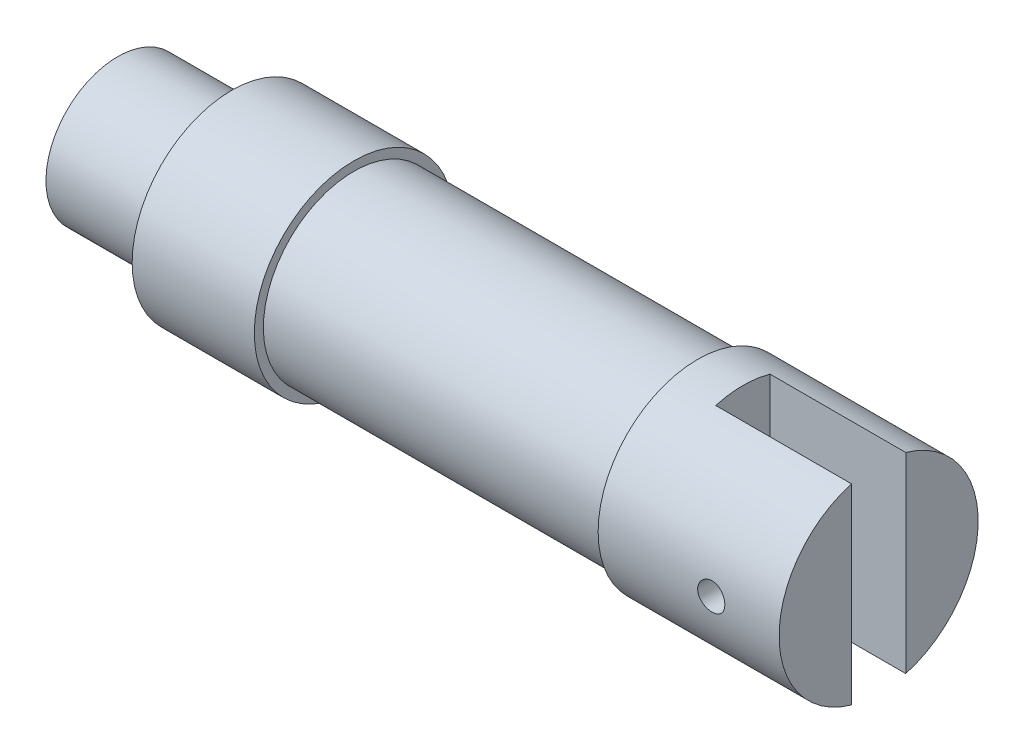
ISO-10303-21;
HEADER;
FILE_DESCRIPTION(('STEP AP214'),'2;1');
FILE_NAME('part.step','',(''),(''),'','','');
FILE_SCHEMA(('AUTOMOTIVE_DESIGN { 1 0 10303 214 1 1 1 1 }'));
ENDSEC;
DATA;
#1=APPLICATION_CONTEXT('core data for automotive mechanical design processes');
#2=APPLICATION_PROTOCOL_DEFINITION('international standard','automotive_design',2000,#1);
#3=PRODUCT_CONTEXT('',#1,'mechanical');
#4=PRODUCT('Part','Part','',(#3));
#5=PRODUCT_RELATED_PRODUCT_CATEGORY('part','',(#4));
#6=PRODUCT_DEFINITION_FORMATION('','',#4);
#7=PRODUCT_DEFINITION_CONTEXT('part definition',#1,'design');
#8=PRODUCT_DEFINITION('design','',#6,#7);
#9=PRODUCT_DEFINITION_SHAPE('','',#8);
#10=(LENGTH_UNIT() NAMED_UNIT(*) SI_UNIT(.MILLI.,.METRE.));
#11=(NAMED_UNIT(*) PLANE_ANGLE_UNIT() SI_UNIT($,.RADIAN.));
#12=(NAMED_UNIT(*) SI_UNIT($,.STERADIAN.) SOLID_ANGLE_UNIT());
#13=UNCERTAINTY_MEASURE_WITH_UNIT(LENGTH_MEASURE(1.E-05),#10,'distance_accuracy_value','');
#14=(GEOMETRIC_REPRESENTATION_CONTEXT(3) GLOBAL_UNCERTAINTY_ASSIGNED_CONTEXT((#13)) GLOBAL_UNIT_ASSIGNED_CONTEXT((#10,
#11,#12)) REPRESENTATION_CONTEXT('',''));
#15=CARTESIAN_POINT('',(0.,0.,0.));
#16=DIRECTION('',(0.,0.,1.));
#17=DIRECTION('',(1.,0.,0.));
#18=AXIS2_PLACEMENT_3D('',#15,#16,#17);
#19=CARTESIAN_POINT('',(168.2,22.,0.));
#20=DIRECTION('',(-1.,0.,0.));
#21=DIRECTION('',(0.,-1.,0.));
#22=AXIS2_PLACEMENT_3D('',#19,#20,#21);
#23=PLANE('',#22);
#24=CARTESIAN_POINT('',(168.2,0.,0.));
#25=DIRECTION('',(-1.,0.,0.));
#26=DIRECTION('',(0.,-1.,0.));
#27=AXIS2_PLACEMENT_3D('',#24,#25,#26);
#28=CIRCLE('',#27,22.);
#29=CARTESIAN_POINT('',(168.2,-21.1660104885167,6.));
#30=VERTEX_POINT('',#29);
#31=CARTESIAN_POINT('',(168.2,21.1660104885167,6.));
#32=VERTEX_POINT('',#31);
#33=EDGE_CURVE('E106',#30,#32,#28,.T.);
#34=ORIENTED_EDGE('',*,*,#33,.F.);
#35=DIRECTION('',(0.,1.,0.));
#36=VECTOR('',#35,1.);
#37=CARTESIAN_POINT('',(168.2,22.,6.));
#38=LINE('',#37,#36);
#39=EDGE_CURVE('E136',#30,#32,#38,.T.);
#40=ORIENTED_EDGE('',*,*,#39,.T.);
#41=EDGE_LOOP('',(#34,#40));
#42=FACE_BOUND('',#41,.T.);
#43=ADVANCED_FACE('F41',(#42),#23,.F.);
#44=CARTESIAN_POINT('',(40.,3.,0.));
#45=DIRECTION('',(1.,0.,0.));
#46=DIRECTION('',(0.,1.,0.));
#47=AXIS2_PLACEMENT_3D('',#44,#45,#46);
#48=PLANE('',#47);
#49=CARTESIAN_POINT('',(40.,0.,0.));
#50=DIRECTION('',(-1.,0.,0.));
#51=DIRECTION('',(0.,-1.,0.));
#52=AXIS2_PLACEMENT_3D('',#49,#50,#51);
#53=CIRCLE('',#52,3.);
#54=CARTESIAN_POINT('',(40.,-3.,0.));
#55=VERTEX_POINT('',#54);
#56=EDGE_CURVE('E131',#55,#55,#53,.T.);
#57=ORIENTED_EDGE('',*,*,#56,.T.);
#58=EDGE_LOOP('',(#57));
#59=FACE_BOUND('',#58,.T.);
#60=ADVANCED_FACE('F43',(#59),#48,.F.);
#61=CARTESIAN_POINT('',(40.,0.,0.));
#62=DIRECTION('',(-1.,0.,0.));
#63=DIRECTION('',(0.,-1.,0.));
#64=AXIS2_PLACEMENT_3D('',#61,#62,#63);
#65=CYLINDRICAL_SURFACE('',#64,3.);
#66=ORIENTED_EDGE('',*,*,#56,.F.);
#67=EDGE_LOOP('',(#66));
#68=FACE_BOUND('',#67,.T.);
#69=CARTESIAN_POINT('',(0.,0.,0.));
#70=DIRECTION('',(-1.,0.,0.));
#71=DIRECTION('',(0.,-1.,0.));
#72=AXIS2_PLACEMENT_3D('',#69,#70,#71);
#73=CIRCLE('',#72,3.);
#74=CARTESIAN_POINT('',(0.,-3.,0.));
#75=VERTEX_POINT('',#74);
#76=EDGE_CURVE('E128',#75,#75,#73,.T.);
#77=ORIENTED_EDGE('',*,*,#76,.T.);
#78=EDGE_LOOP('',(#77));
#79=FACE_BOUND('',#78,.T.);
#80=ADVANCED_FACE('F148',(#68,#79),#65,.F.);
#81=CARTESIAN_POINT('',(0.,3.,0.));
#82=DIRECTION('',(1.,0.,0.));
#83=DIRECTION('',(0.,1.,0.));
#84=AXIS2_PLACEMENT_3D('',#81,#82,#83);
#85=PLANE('',#84);
#86=ORIENTED_EDGE('',*,*,#76,.F.);
#87=EDGE_LOOP('',(#86));
#88=FACE_BOUND('',#87,.T.);
#89=CARTESIAN_POINT('',(0.,0.,0.));
#90=DIRECTION('',(-1.,0.,0.));
#91=DIRECTION('',(0.,-1.,0.));
#92=AXIS2_PLACEMENT_3D('',#89,#90,#91);
#93=CIRCLE('',#92,15.85);
#94=CARTESIAN_POINT('',(0.,-15.85,0.));
#95=VERTEX_POINT('',#94);
#96=EDGE_CURVE('E125',#95,#95,#93,.T.);
#97=ORIENTED_EDGE('',*,*,#96,.T.);
#98=EDGE_LOOP('',(#97));
#99=FACE_BOUND('',#98,.T.);
#100=ADVANCED_FACE('F309',(#88,#99),#85,.F.);
#101=CARTESIAN_POINT('',(40.,0.,0.));
#102=DIRECTION('',(-1.,0.,0.));
#103=DIRECTION('',(0.,-1.,0.));
#104=AXIS2_PLACEMENT_3D('',#101,#102,#103);
#105=CYLINDRICAL_SURFACE('',#104,15.85);
#106=ORIENTED_EDGE('',*,*,#96,.F.);
#107=EDGE_LOOP('',(#106));
#108=FACE_BOUND('',#107,.T.);
#109=CARTESIAN_POINT('',(25.2,0.,0.));
#110=DIRECTION('',(-1.,0.,0.));
#111=DIRECTION('',(0.,-1.,0.));
#112=AXIS2_PLACEMENT_3D('',#109,#110,#111);
#113=CIRCLE('',#112,15.85);
#114=CARTESIAN_POINT('',(25.2,-15.85,0.));
#115=VERTEX_POINT('',#114);
#116=EDGE_CURVE('E122',#115,#115,#113,.T.);
#117=ORIENTED_EDGE('',*,*,#116,.T.);
#118=EDGE_LOOP('',(#117));
#119=FACE_BOUND('',#118,.T.);
#120=ADVANCED_FACE('F298',(#108,#119),#105,.T.);
#121=CARTESIAN_POINT('',(25.2,15.85,0.));
#122=DIRECTION('',(1.,0.,0.));
#123=DIRECTION('',(0.,1.,0.));
#124=AXIS2_PLACEMENT_3D('',#121,#122,#123);
#125=PLANE('',#124);
#126=ORIENTED_EDGE('',*,*,#116,.F.);
#127=EDGE_LOOP('',(#126));
#128=FACE_BOUND('',#127,.T.);
#129=CARTESIAN_POINT('',(25.2,0.,0.));
#130=DIRECTION('',(-1.,0.,0.));
#131=DIRECTION('',(0.,-1.,0.));
#132=AXIS2_PLACEMENT_3D('',#129,#130,#131);
#133=CIRCLE('',#132,22.);
#134=CARTESIAN_POINT('',(25.2,-22.,0.));
#135=VERTEX_POINT('',#134);
#136=EDGE_CURVE('E119',#135,#135,#133,.T.);
#137=ORIENTED_EDGE('',*,*,#136,.T.);
#138=EDGE_LOOP('',(#137));
#139=FACE_BOUND('',#138,.T.);
#140=ADVANCED_FACE('F287',(#128,#139),#125,.F.);
#141=CARTESIAN_POINT('',(40.,0.,0.));
#142=DIRECTION('',(-1.,0.,0.));
#143=DIRECTION('',(0.,-1.,0.));
#144=AXIS2_PLACEMENT_3D('',#141,#142,#143);
#145=CYLINDRICAL_SURFACE('',#144,22.);
#146=ORIENTED_EDGE('',*,*,#136,.F.);
#147=EDGE_LOOP('',(#146));
#148=FACE_BOUND('',#147,.T.);
#149=CARTESIAN_POINT('',(52.2,0.,0.));
#150=DIRECTION('',(-1.,0.,0.));
#151=DIRECTION('',(0.,-1.,0.));
#152=AXIS2_PLACEMENT_3D('',#149,#150,#151);
#153=CIRCLE('',#152,22.);
#154=CARTESIAN_POINT('',(52.2,-22.,0.));
#155=VERTEX_POINT('',#154);
#156=EDGE_CURVE('E116',#155,#155,#153,.T.);
#157=ORIENTED_EDGE('',*,*,#156,.T.);
#158=EDGE_LOOP('',(#157));
#159=FACE_BOUND('',#158,.T.);
#160=ADVANCED_FACE('F276',(#148,#159),#145,.T.);
#161=CARTESIAN_POINT('',(52.2,22.,0.));
#162=DIRECTION('',(-1.,0.,0.));
#163=DIRECTION('',(0.,-1.,0.));
#164=AXIS2_PLACEMENT_3D('',#161,#162,#163);
#165=PLANE('',#164);
#166=ORIENTED_EDGE('',*,*,#156,.F.);
#167=EDGE_LOOP('',(#166));
#168=FACE_BOUND('',#167,.T.);
#169=CARTESIAN_POINT('',(52.2,0.,0.));
#170=DIRECTION('',(-1.,0.,0.));
#171=DIRECTION('',(0.,-1.,0.));
#172=AXIS2_PLACEMENT_3D('',#169,#170,#171);
#173=CIRCLE('',#172,20.);
#174=CARTESIAN_POINT('',(52.2,-20.,0.));
#175=VERTEX_POINT('',#174);
#176=EDGE_CURVE('E113',#175,#175,#173,.T.);
#177=ORIENTED_EDGE('',*,*,#176,.T.);
#178=EDGE_LOOP('',(#177));
#179=FACE_BOUND('',#178,.T.);
#180=ADVANCED_FACE('F265',(#168,#179),#165,.F.);
#181=CARTESIAN_POINT('',(40.,0.,0.));
#182=DIRECTION('',(-1.,0.,0.));
#183=DIRECTION('',(0.,-1.,0.));
#184=AXIS2_PLACEMENT_3D('',#181,#182,#183);
#185=CYLINDRICAL_SURFACE('',#184,20.);
#186=ORIENTED_EDGE('',*,*,#176,.F.);
#187=EDGE_LOOP('',(#186));
#188=FACE_BOUND('',#187,.T.);
#189=CARTESIAN_POINT('',(128.2,0.,0.));
#190=DIRECTION('',(-1.,0.,0.));
#191=DIRECTION('',(0.,-1.,0.));
#192=AXIS2_PLACEMENT_3D('',#189,#190,#191);
#193=CIRCLE('',#192,20.);
#194=CARTESIAN_POINT('',(128.2,-20.,0.));
#195=VERTEX_POINT('',#194);
#196=EDGE_CURVE('E110',#195,#195,#193,.T.);
#197=ORIENTED_EDGE('',*,*,#196,.T.);
#198=EDGE_LOOP('',(#197));
#199=FACE_BOUND('',#198,.T.);
#200=ADVANCED_FACE('F164',(#188,#199),#185,.T.);
#201=CARTESIAN_POINT('',(128.2,20.,0.));
#202=DIRECTION('',(1.,0.,0.));
#203=DIRECTION('',(0.,1.,0.));
#204=AXIS2_PLACEMENT_3D('',#201,#202,#203);
#205=PLANE('',#204);
#206=ORIENTED_EDGE('',*,*,#196,.F.);
#207=EDGE_LOOP('',(#206));
#208=FACE_BOUND('',#207,.T.);
#209=CARTESIAN_POINT('',(128.2,0.,0.));
#210=DIRECTION('',(-1.,0.,0.));
#211=DIRECTION('',(0.,-1.,0.));
#212=AXIS2_PLACEMENT_3D('',#209,#210,#211);
#213=CIRCLE('',#212,22.);
#214=CARTESIAN_POINT('',(128.2,-22.,0.));
#215=VERTEX_POINT('',#214);
#216=EDGE_CURVE('E107',#215,#215,#213,.T.);
#217=ORIENTED_EDGE('',*,*,#216,.T.);
#218=EDGE_LOOP('',(#217));
#219=FACE_BOUND('',#218,.T.);
#220=ADVANCED_FACE('F159',(#208,#219),#205,.F.);
#221=CARTESIAN_POINT('',(40.,0.,0.));
#222=DIRECTION('',(-1.,0.,0.));
#223=DIRECTION('',(0.,-1.,0.));
#224=AXIS2_PLACEMENT_3D('',#221,#222,#223);
#225=CYLINDRICAL_SURFACE('',#224,22.);
#226=CARTESIAN_POINT('',(156.2,0.,-22.));
#227=CARTESIAN_POINT('',(156.199992961085,0.167676826859713,-21.9999974934523));
#228=CARTESIAN_POINT('',(156.185894814655,0.335455204579483,-21.9980628542975));
#229=CARTESIAN_POINT('',(156.129882233551,0.666334195282816,-21.990531328169));
#230=CARTESIAN_POINT('',(156.0879396011,0.829429891319706,-21.984930728802));
#231=CARTESIAN_POINT('',(155.977504532319,1.14610618738718,-21.9706975479658));
#232=CARTESIAN_POINT('',(155.909030921596,1.29969344490645,-21.9620671167838));
#233=CARTESIAN_POINT('',(155.74752095088,1.59317060489946,-21.9427314544459));
#234=CARTESIAN_POINT('',(155.654488455491,1.73306265771743,-21.9320265498011));
#235=CARTESIAN_POINT('',(155.445855571415,1.99611512762448,-21.9096571993851));
#236=CARTESIAN_POINT('',(155.330127153993,2.11917356924752,-21.8979875381044));
#237=CARTESIAN_POINT('',(155.079662778415,2.34418667816086,-21.8750454311864));
#238=CARTESIAN_POINT('',(154.944925800277,2.44614021225597,-21.863773006905));
#239=CARTESIAN_POINT('',(154.659596123552,2.62643701049845,-21.8428507554376));
#240=CARTESIAN_POINT('',(154.50894162999,2.70468332936807,-21.833207660216));
#241=CARTESIAN_POINT('',(154.196476369253,2.83472528970555,-21.8167058813552));
#242=CARTESIAN_POINT('',(154.03466610478,2.88652212215969,-21.8098470723459));
#243=CARTESIAN_POINT('',(153.705547512853,2.96188181110179,-21.7997409938434));
#244=CARTESIAN_POINT('',(153.538279561418,2.98561797729097,-21.7964715644898));
#245=CARTESIAN_POINT('',(153.202105053952,3.00471910119332,-21.7938468760964));
#246=CARTESIAN_POINT('',(153.033198576334,3.00008540995951,-21.7944914306616));
#247=CARTESIAN_POINT('',(152.699756548798,2.96272034038478,-21.7996016067311));
#248=CARTESIAN_POINT('',(152.535199047266,2.93018077835179,-21.8040411420393));
#249=CARTESIAN_POINT('',(152.213901918935,2.83822735390598,-21.8162003481636));
#250=CARTESIAN_POINT('',(152.057162477974,2.77881285300505,-21.8239200969101));
#251=CARTESIAN_POINT('',(151.755360147925,2.63459283520414,-21.841799165874));
#252=CARTESIAN_POINT('',(151.610337141464,2.54970487715522,-21.851966385515));
#253=CARTESIAN_POINT('',(151.336521702228,2.35700646089641,-21.8735888866938));
#254=CARTESIAN_POINT('',(151.207730152467,2.24919475646083,-21.8850442382436));
#255=CARTESIAN_POINT('',(150.968920891011,2.01265055567599,-21.908067947796));
#256=CARTESIAN_POINT('',(150.859066719375,1.88375290146846,-21.9196364588217));
#257=CARTESIAN_POINT('',(150.662527016803,1.60926188881081,-21.9414949411558));
#258=CARTESIAN_POINT('',(150.575841558074,1.46366847832926,-21.9517849084796));
#259=CARTESIAN_POINT('',(150.42809627364,1.15978593896088,-21.9699350817542));
#260=CARTESIAN_POINT('',(150.367047715215,1.00149126426257,-21.9777942189694));
#261=CARTESIAN_POINT('',(150.272444324109,0.676766175879787,-21.9901879040614));
#262=CARTESIAN_POINT('',(150.238887957813,0.510336216560255,-21.994722637384));
#263=CARTESIAN_POINT('',(150.200435830869,0.175477814735334,-21.9999322760751));
#264=CARTESIAN_POINT('',(150.195314982823,0.00707567277567577,-22.0006374938028));
#265=CARTESIAN_POINT('',(150.213283756661,-0.328184588178519,-21.9981907754197));
#266=CARTESIAN_POINT('',(150.236372660566,-0.495042746360847,-21.9950389374767));
#267=CARTESIAN_POINT('',(150.309918446419,-0.821806756729903,-21.9852510531583));
#268=CARTESIAN_POINT('',(150.360266991143,-0.981737441241129,-21.9786288024664));
#269=CARTESIAN_POINT('',(150.486789518066,-1.29088628219118,-21.9626408812727));
#270=CARTESIAN_POINT('',(150.562964526034,-1.44010401285044,-21.9532751018062));
#271=CARTESIAN_POINT('',(150.739515077448,-1.72458978596493,-21.9327672607206));
#272=CARTESIAN_POINT('',(150.840035005601,-1.8597674567065,-21.921614741142));
#273=CARTESIAN_POINT('',(151.062219155915,-2.11141402650923,-21.8988110628535));
#274=CARTESIAN_POINT('',(151.183884384113,-2.22788203490665,-21.8871598804385));
#275=CARTESIAN_POINT('',(151.445901666017,-2.43961065908227,-21.8645773754606));
#276=CARTESIAN_POINT('',(151.586375426962,-2.53472132761286,-21.8536515002427));
#277=CARTESIAN_POINT('',(151.8814366154,-2.69999679098532,-21.8338493008832));
#278=CARTESIAN_POINT('',(152.036023715717,-2.77016216392284,-21.8249729292469));
#279=CARTESIAN_POINT('',(152.354455513346,-2.88331699010305,-21.8103129452134));
#280=CARTESIAN_POINT('',(152.518270588872,-2.92638854100027,-21.8045199979441));
#281=CARTESIAN_POINT('',(152.850893043656,-2.98439621095037,-21.7966568632046));
#282=CARTESIAN_POINT('',(153.019700142029,-2.99933390995801,-21.7945864666819));
#283=CARTESIAN_POINT('',(153.356021950782,-3.00061713169436,-21.7944097083055));
#284=CARTESIAN_POINT('',(153.523535793217,-2.98719829381275,-21.796270677241));
#285=CARTESIAN_POINT('',(153.853902277397,-2.93265092877067,-21.8036764010729));
#286=CARTESIAN_POINT('',(154.016754921802,-2.89152241742378,-21.809221153867));
#287=CARTESIAN_POINT('',(154.33313027877,-2.7828011290096,-21.8233590163958));
#288=CARTESIAN_POINT('',(154.486657734965,-2.71522193961382,-21.8319505607859));
#289=CARTESIAN_POINT('',(154.780232597213,-2.5555407967824,-21.85121622249));
#290=CARTESIAN_POINT('',(154.920279708521,-2.46343830731649,-21.8618903853246));
#291=CARTESIAN_POINT('',(155.1841200732,-2.25645830446167,-21.884224598437));
#292=CARTESIAN_POINT('',(155.307775272445,-2.14140556846806,-21.8958918112072));
#293=CARTESIAN_POINT('',(155.534110693422,-1.89215973610724,-21.9188357460712));
#294=CARTESIAN_POINT('',(155.636785996623,-1.7579621639157,-21.9301123760831));
#295=CARTESIAN_POINT('',(155.818651934767,-1.47353098640399,-21.9510618593984));
#296=CARTESIAN_POINT('',(155.897734316553,-1.32322763703471,-21.9607272329125));
#297=CARTESIAN_POINT('',(156.029418962106,-1.01141938786062,-21.9772907411432));
#298=CARTESIAN_POINT('',(156.082049419387,-0.849926624043754,-21.9841918205545));
#299=CARTESIAN_POINT('',(156.147020874128,-0.573037194174386,-21.9928235213462));
#300=CARTESIAN_POINT('',(156.166858721595,-0.459371577392151,-21.9955012855773));
#301=CARTESIAN_POINT('',(156.193350641962,-0.230486627293779,-21.9990903781477));
#302=CARTESIAN_POINT('',(156.200004838813,-0.115267308595407,-22.0000017230944));
#303=CARTESIAN_POINT('',(156.2,0.,-22.));
#304=B_SPLINE_CURVE_WITH_KNOTS('',3,(#226,#227,#228,#229,#230,#231,#232,#233,#234,#235,#236,
#237,#238,#239,#240,#241,#242,#243,#244,#245,#246,#247,#248,#249,#250,#251,#252,#253,#254,#255,
#256,#257,#258,#259,#260,#261,#262,#263,#264,#265,#266,#267,#268,#269,#270,#271,#272,#273,#274,
#275,#276,#277,#278,#279,#280,#281,#282,#283,#284,#285,#286,#287,#288,#289,#290,#291,#292,#293,
#294,#295,#296,#297,#298,#299,#300,#301,#302,#303),.UNSPECIFIED.,.T.,.F.,(4,2,2,2,2,2,2,2,2,2,2,
2,2,2,2,2,2,2,2,2,2,2,2,2,2,2,2,2,2,2,2,2,2,2,2,2,2,2,4),(0.,0.502609376172297,1.00572851685899,
1.50849131075064,2.0111750366105,2.51678051739006,3.02241313883224,3.53008635854346,
4.03773671636778,4.54223504001233,5.04670933820383,5.54774357745447,6.04878972077748,
6.55147524370065,7.05418810159104,7.56104569493678,8.06790486792018,8.57498657022921,
9.0820399837334,9.58507392409647,10.0880950617602,10.5891315761908,11.0901879929896,
11.5942921539578,12.0984203054351,12.6059843025882,13.1135365364146,13.619543320099,
14.1255216863572,14.6273119749012,15.1291019770798,15.6306345481248,16.1321780825684,
16.6377084708873,17.1433572401882,17.6512916404935,18.1586835098852,18.5041992012524,
18.8497116441534),.UNSPECIFIED.);
#305=CARTESIAN_POINT('',(156.2,0.,-22.));
#306=VERTEX_POINT('',#305);
#307=EDGE_CURVE('E90',#306,#306,#304,.T.);
#308=ORIENTED_EDGE('',*,*,#307,.T.);
#309=EDGE_LOOP('',(#308));
#310=FACE_BOUND('',#309,.T.);
#311=CARTESIAN_POINT('',(156.2,0.,22.));
#312=CARTESIAN_POINT('',(156.199992961085,-0.16767682685972,21.9999974934523));
#313=CARTESIAN_POINT('',(156.185894814655,-0.33545520457949,21.9980628542975));
#314=CARTESIAN_POINT('',(156.129882233551,-0.666334195282822,21.990531328169));
#315=CARTESIAN_POINT('',(156.0879396011,-0.829429891319712,21.984930728802));
#316=CARTESIAN_POINT('',(155.977504532319,-1.14610618738719,21.9706975479658));
#317=CARTESIAN_POINT('',(155.909030921596,-1.29969344490646,21.9620671167838));
#318=CARTESIAN_POINT('',(155.74752095088,-1.59317060489947,21.9427314544459));
#319=CARTESIAN_POINT('',(155.654488455491,-1.73306265771744,21.9320265498011));
#320=CARTESIAN_POINT('',(155.445855571415,-1.99611512762449,21.9096571993851));
#321=CARTESIAN_POINT('',(155.330127153993,-2.11917356924753,21.8979875381044));
#322=CARTESIAN_POINT('',(155.079662778415,-2.34418667816088,21.8750454311864));
#323=CARTESIAN_POINT('',(154.944925800277,-2.44614021225599,21.863773006905));
#324=CARTESIAN_POINT('',(154.659596123552,-2.62643701049847,21.8428507554376));
#325=CARTESIAN_POINT('',(154.50894162999,-2.70468332936808,21.833207660216));
#326=CARTESIAN_POINT('',(154.196476369253,-2.83472528970556,21.8167058813552));
#327=CARTESIAN_POINT('',(154.03466610478,-2.8865221221597,21.8098470723459));
#328=CARTESIAN_POINT('',(153.705547512853,-2.9618818111018,21.7997409938434));
#329=CARTESIAN_POINT('',(153.538279561418,-2.98561797729098,21.7964715644898));
#330=CARTESIAN_POINT('',(153.202105053952,-3.00471910119334,21.7938468760964));
#331=CARTESIAN_POINT('',(153.033198576334,-3.00008540995952,21.7944914306616));
#332=CARTESIAN_POINT('',(152.699756548798,-2.9627203403848,21.7996016067311));
#333=CARTESIAN_POINT('',(152.535199047266,-2.9301807783518,21.8040411420393));
#334=CARTESIAN_POINT('',(152.213901918935,-2.838227353906,21.8162003481636));
#335=CARTESIAN_POINT('',(152.057162477974,-2.77881285300506,21.8239200969101));
#336=CARTESIAN_POINT('',(151.755360147925,-2.63459283520415,21.841799165874));
#337=CARTESIAN_POINT('',(151.610337141464,-2.54970487715523,21.851966385515));
#338=CARTESIAN_POINT('',(151.336521702228,-2.35700646089642,21.8735888866938));
#339=CARTESIAN_POINT('',(151.207730152467,-2.24919475646084,21.8850442382436));
#340=CARTESIAN_POINT('',(150.968920891011,-2.01265055567601,21.908067947796));
#341=CARTESIAN_POINT('',(150.859066719375,-1.88375290146847,21.9196364588217));
#342=CARTESIAN_POINT('',(150.662527016803,-1.60926188881082,21.9414949411558));
#343=CARTESIAN_POINT('',(150.575841558074,-1.46366847832928,21.9517849084796));
#344=CARTESIAN_POINT('',(150.42809627364,-1.15978593896089,21.9699350817542));
#345=CARTESIAN_POINT('',(150.367047715215,-1.00149126426258,21.9777942189694));
#346=CARTESIAN_POINT('',(150.272444324109,-0.676766175879793,21.9901879040614));
#347=CARTESIAN_POINT('',(150.238887957813,-0.510336216560266,21.994722637384));
#348=CARTESIAN_POINT('',(150.200435830869,-0.175477814735353,21.9999322760751));
#349=CARTESIAN_POINT('',(150.195314982823,-0.0070756727756958,22.0006374938028));
#350=CARTESIAN_POINT('',(150.213283756661,0.328184588178499,21.9981907754197));
#351=CARTESIAN_POINT('',(150.236372660566,0.495042746360828,21.9950389374767));
#352=CARTESIAN_POINT('',(150.309918446419,0.82180675672988,21.9852510531583));
#353=CARTESIAN_POINT('',(150.360266991143,0.981737441241101,21.9786288024664));
#354=CARTESIAN_POINT('',(150.486789518066,1.29088628219116,21.9626408812727));
#355=CARTESIAN_POINT('',(150.562964526034,1.44010401285042,21.9532751018062));
#356=CARTESIAN_POINT('',(150.739515077448,1.72458978596491,21.9327672607206));
#357=CARTESIAN_POINT('',(150.840035005601,1.85976745670648,21.921614741142));
#358=CARTESIAN_POINT('',(151.062219155915,2.11141402650919,21.8988110628535));
#359=CARTESIAN_POINT('',(151.183884384113,2.22788203490662,21.8871598804385));
#360=CARTESIAN_POINT('',(151.445901666017,2.43961065908223,21.8645773754606));
#361=CARTESIAN_POINT('',(151.586375426962,2.53472132761282,21.8536515002427));
#362=CARTESIAN_POINT('',(151.8814366154,2.69999679098529,21.8338493008832));
#363=CARTESIAN_POINT('',(152.036023715717,2.77016216392281,21.8249729292469));
#364=CARTESIAN_POINT('',(152.354455513346,2.88331699010303,21.8103129452134));
#365=CARTESIAN_POINT('',(152.518270588872,2.92638854100025,21.8045199979441));
#366=CARTESIAN_POINT('',(152.850893043656,2.98439621095035,21.7966568632046));
#367=CARTESIAN_POINT('',(153.019700142029,2.99933390995799,21.7945864666819));
#368=CARTESIAN_POINT('',(153.356021950782,3.00061713169435,21.7944097083055));
#369=CARTESIAN_POINT('',(153.523535793217,2.98719829381274,21.796270677241));
#370=CARTESIAN_POINT('',(153.853902277397,2.93265092877066,21.8036764010729));
#371=CARTESIAN_POINT('',(154.016754921802,2.89152241742377,21.809221153867));
#372=CARTESIAN_POINT('',(154.33313027877,2.78280112900959,21.8233590163958));
#373=CARTESIAN_POINT('',(154.486657734965,2.71522193961381,21.8319505607859));
#374=CARTESIAN_POINT('',(154.780232597213,2.55554079678239,21.85121622249));
#375=CARTESIAN_POINT('',(154.920279708521,2.46343830731648,21.8618903853246));
#376=CARTESIAN_POINT('',(155.1841200732,2.25645830446165,21.884224598437));
#377=CARTESIAN_POINT('',(155.307775272445,2.14140556846804,21.8958918112072));
#378=CARTESIAN_POINT('',(155.534110693422,1.89215973610723,21.9188357460712));
#379=CARTESIAN_POINT('',(155.636785996623,1.75796216391568,21.9301123760831));
#380=CARTESIAN_POINT('',(155.818651934767,1.47353098640398,21.9510618593984));
#381=CARTESIAN_POINT('',(155.897734316553,1.32322763703471,21.9607272329125));
#382=CARTESIAN_POINT('',(156.029418962106,1.01141938786063,21.9772907411432));
#383=CARTESIAN_POINT('',(156.082049419387,0.849926624043749,21.9841918205545));
#384=CARTESIAN_POINT('',(156.147020874128,0.573037194174375,21.9928235213462));
#385=CARTESIAN_POINT('',(156.166858721595,0.459371577392141,21.9955012855773));
#386=CARTESIAN_POINT('',(156.193350641962,0.23048662729377,21.9990903781477));
#387=CARTESIAN_POINT('',(156.200004838813,0.115267308595399,22.0000017230944));
#388=CARTESIAN_POINT('',(156.2,0.,22.));
#389=B_SPLINE_CURVE_WITH_KNOTS('',3,(#311,#312,#313,#314,#315,#316,#317,#318,#319,#320,#321,
#322,#323,#324,#325,#326,#327,#328,#329,#330,#331,#332,#333,#334,#335,#336,#337,#338,#339,#340,
#341,#342,#343,#344,#345,#346,#347,#348,#349,#350,#351,#352,#353,#354,#355,#356,#357,#358,#359,
#360,#361,#362,#363,#364,#365,#366,#367,#368,#369,#370,#371,#372,#373,#374,#375,#376,#377,#378,
#379,#380,#381,#382,#383,#384,#385,#386,#387,#388),.UNSPECIFIED.,.T.,.F.,(4,2,2,2,2,2,2,2,2,2,2,
2,2,2,2,2,2,2,2,2,2,2,2,2,2,2,2,2,2,2,2,2,2,2,2,2,2,2,4),(0.,0.502609376172297,1.00572851685899,
1.50849131075065,2.0111750366105,2.51678051739006,3.02241313883225,3.53008635854346,
4.03773671636778,4.54223504001234,5.04670933820383,5.54774357745447,6.04878972077749,
6.55147524370066,7.05418810159105,7.56104569493678,8.06790486792019,8.57498657022922,
9.0820399837334,9.58507392409647,10.0880950617602,10.5891315761908,11.0901879929896,
11.5942921539578,12.098420305435,12.6059843025881,13.1135365364145,13.619543320099,
14.1255216863571,14.6273119749012,15.1291019770798,15.6306345481248,16.1321780825684,
16.6377084708873,17.1433572401882,17.6512916404935,18.1586835098852,18.5041992012524,
18.8497116441534),.UNSPECIFIED.);
#390=CARTESIAN_POINT('',(156.2,0.,22.));
#391=VERTEX_POINT('',#390);
#392=EDGE_CURVE('E173',#391,#391,#389,.T.);
#393=ORIENTED_EDGE('',*,*,#392,.T.);
#394=EDGE_LOOP('',(#393));
#395=FACE_BOUND('',#394,.T.);
#396=ORIENTED_EDGE('',*,*,#216,.F.);
#397=EDGE_LOOP('',(#396));
#398=FACE_BOUND('',#397,.T.);
#399=ORIENTED_EDGE('',*,*,#33,.T.);
#400=DIRECTION('',(-1.,0.,0.));
#401=VECTOR('',#400,1.);
#402=CARTESIAN_POINT('',(40.,21.1660104885167,6.00000000000001));
#403=LINE('',#402,#401);
#404=CARTESIAN_POINT('',(138.2,21.1660104885167,6.));
#405=VERTEX_POINT('',#404);
#406=EDGE_CURVE('E99',#32,#405,#403,.T.);
#407=ORIENTED_EDGE('',*,*,#406,.T.);
#408=CARTESIAN_POINT('',(138.2,0.,0.));
#409=DIRECTION('',(-1.,0.,0.));
#410=DIRECTION('',(0.,0.,1.));
#411=AXIS2_PLACEMENT_3D('',#408,#409,#410);
#412=CIRCLE('',#411,22.);
#413=CARTESIAN_POINT('',(138.2,21.1660104885167,-6.));
#414=VERTEX_POINT('',#413);
#415=EDGE_CURVE('E50',#405,#414,#412,.T.);
#416=ORIENTED_EDGE('',*,*,#415,.T.);
#417=DIRECTION('',(-1.,0.,0.));
#418=VECTOR('',#417,1.);
#419=CARTESIAN_POINT('',(40.,21.1660104885167,-6.00000000000001));
#420=LINE('',#419,#418);
#421=CARTESIAN_POINT('',(168.2,21.1660104885167,-6.));
#422=VERTEX_POINT('',#421);
#423=EDGE_CURVE('E89',#414,#422,#420,.F.);
#424=ORIENTED_EDGE('',*,*,#423,.T.);
#425=CARTESIAN_POINT('',(168.2,-21.1660104885167,-6.));
#426=VERTEX_POINT('',#425);
#427=EDGE_CURVE('E96',#422,#426,#28,.T.);
#428=ORIENTED_EDGE('',*,*,#427,.T.);
#429=DIRECTION('',(-1.,0.,0.));
#430=VECTOR('',#429,1.);
#431=CARTESIAN_POINT('',(40.,-21.1660104885167,-6.00000000000001));
#432=LINE('',#431,#430);
#433=CARTESIAN_POINT('',(138.2,-21.1660104885167,-6.));
#434=VERTEX_POINT('',#433);
#435=EDGE_CURVE('E57',#426,#434,#432,.T.);
#436=ORIENTED_EDGE('',*,*,#435,.T.);
#437=CARTESIAN_POINT('',(138.2,-21.1660104885167,6.));
#438=VERTEX_POINT('',#437);
#439=EDGE_CURVE('E11',#434,#438,#412,.T.);
#440=ORIENTED_EDGE('',*,*,#439,.T.);
#441=DIRECTION('',(-1.,0.,0.));
#442=VECTOR('',#441,1.);
#443=CARTESIAN_POINT('',(40.,-21.1660104885167,6.00000000000001));
#444=LINE('',#443,#442);
#445=EDGE_CURVE('E97',#438,#30,#444,.F.);
#446=ORIENTED_EDGE('',*,*,#445,.T.);
#447=EDGE_LOOP('',(#399,#407,#416,#424,#428,#436,#440,#446));
#448=FACE_BOUND('',#447,.T.);
#449=ADVANCED_FACE('F94',(#310,#395,#398,#448),#225,.T.);
#450=ORIENTED_EDGE('',*,*,#427,.F.);
#451=DIRECTION('',(0.,-1.,0.));
#452=VECTOR('',#451,1.);
#453=CARTESIAN_POINT('',(168.2,22.,-6.));
#454=LINE('',#453,#452);
#455=EDGE_CURVE('E134',#422,#426,#454,.T.);
#456=ORIENTED_EDGE('',*,*,#455,.T.);
#457=EDGE_LOOP('',(#450,#456));
#458=FACE_BOUND('',#457,.T.);
#459=ADVANCED_FACE('F144',(#458),#23,.F.);
#460=CARTESIAN_POINT('',(138.2,-22.,-6.));
#461=DIRECTION('',(-1.,0.,0.));
#462=DIRECTION('',(0.,0.,1.));
#463=AXIS2_PLACEMENT_3D('',#460,#461,#462);
#464=PLANE('',#463);
#465=DIRECTION('',(0.,1.,0.));
#466=VECTOR('',#465,1.);
#467=CARTESIAN_POINT('',(138.2,-22.,6.));
#468=LINE('',#467,#466);
#469=EDGE_CURVE('E84',#438,#405,#468,.T.);
#470=ORIENTED_EDGE('',*,*,#469,.F.);
#471=ORIENTED_EDGE('',*,*,#439,.F.);
#472=DIRECTION('',(0.,1.,0.));
#473=VECTOR('',#472,1.);
#474=CARTESIAN_POINT('',(138.2,-22.,-6.));
#475=LINE('',#474,#473);
#476=EDGE_CURVE('E83',#434,#414,#475,.T.);
#477=ORIENTED_EDGE('',*,*,#476,.T.);
#478=ORIENTED_EDGE('',*,*,#415,.F.);
#479=EDGE_LOOP('',(#470,#471,#477,#478));
#480=FACE_BOUND('',#479,.T.);
#481=ADVANCED_FACE('F82',(#480),#464,.F.);
#482=CARTESIAN_POINT('',(168.2,-22.,6.));
#483=DIRECTION('',(0.,0.,1.));
#484=DIRECTION('',(1.,0.,0.));
#485=AXIS2_PLACEMENT_3D('',#482,#483,#484);
#486=PLANE('',#485);
#487=CARTESIAN_POINT('',(153.2,0.,6.));
#488=DIRECTION('',(0.,0.,1.));
#489=DIRECTION('',(1.,0.,0.));
#490=AXIS2_PLACEMENT_3D('',#487,#488,#489);
#491=CIRCLE('',#490,2.99999999999999);
#492=CARTESIAN_POINT('',(156.2,0.,6.));
#493=VERTEX_POINT('',#492);
#494=EDGE_CURVE('E199',#493,#493,#491,.T.);
#495=ORIENTED_EDGE('',*,*,#494,.T.);
#496=EDGE_LOOP('',(#495));
#497=FACE_BOUND('',#496,.T.);
#498=ORIENTED_EDGE('',*,*,#39,.F.);
#499=ORIENTED_EDGE('',*,*,#445,.F.);
#500=ORIENTED_EDGE('',*,*,#469,.T.);
#501=ORIENTED_EDGE('',*,*,#406,.F.);
#502=EDGE_LOOP('',(#498,#499,#500,#501));
#503=FACE_BOUND('',#502,.T.);
#504=ADVANCED_FACE('F140',(#497,#503),#486,.F.);
#505=CARTESIAN_POINT('',(168.2,-22.,-6.));
#506=DIRECTION('',(0.,0.,-1.));
#507=DIRECTION('',(-1.,0.,0.));
#508=AXIS2_PLACEMENT_3D('',#505,#506,#507);
#509=PLANE('',#508);
#510=CARTESIAN_POINT('',(153.2,0.,-6.));
#511=DIRECTION('',(0.,0.,-1.));
#512=DIRECTION('',(-1.,0.,0.));
#513=AXIS2_PLACEMENT_3D('',#510,#511,#512);
#514=CIRCLE('',#513,2.99999999999999);
#515=CARTESIAN_POINT('',(150.2,0.,-6.));
#516=VERTEX_POINT('',#515);
#517=EDGE_CURVE('E45',#516,#516,#514,.T.);
#518=ORIENTED_EDGE('',*,*,#517,.T.);
#519=EDGE_LOOP('',(#518));
#520=FACE_BOUND('',#519,.T.);
#521=ORIENTED_EDGE('',*,*,#455,.F.);
#522=ORIENTED_EDGE('',*,*,#423,.F.);
#523=ORIENTED_EDGE('',*,*,#476,.F.);
#524=ORIENTED_EDGE('',*,*,#435,.F.);
#525=EDGE_LOOP('',(#521,#522,#523,#524));
#526=FACE_BOUND('',#525,.T.);
#527=ADVANCED_FACE('F87',(#520,#526),#509,.F.);
#528=CARTESIAN_POINT('',(153.2,0.,-22.));
#529=DIRECTION('',(0.,0.,1.));
#530=DIRECTION('',(1.,0.,0.));
#531=AXIS2_PLACEMENT_3D('',#528,#529,#530);
#532=CYLINDRICAL_SURFACE('',#531,2.99999999999999);
#533=ORIENTED_EDGE('',*,*,#517,.F.);
#534=EDGE_LOOP('',(#533));
#535=FACE_BOUND('',#534,.T.);
#536=ORIENTED_EDGE('',*,*,#307,.F.);
#537=EDGE_LOOP('',(#536));
#538=FACE_BOUND('',#537,.T.);
#539=ADVANCED_FACE('F184',(#535,#538),#532,.F.);
#540=ORIENTED_EDGE('',*,*,#494,.F.);
#541=EDGE_LOOP('',(#540));
#542=FACE_BOUND('',#541,.T.);
#543=ORIENTED_EDGE('',*,*,#392,.F.);
#544=EDGE_LOOP('',(#543));
#545=FACE_BOUND('',#544,.T.);
#546=ADVANCED_FACE('F188',(#542,#545),#532,.F.);
#547=CLOSED_SHELL('',(#43,#60,#80,#100,#120,#140,#160,#180,#200,#220,#449,#459,#481,#504,#527,
#539,#546));
#548=MANIFOLD_SOLID_BREP('B2',#547);
#549=ADVANCED_BREP_SHAPE_REPRESENTATION('',(#18,#548),#14);
#550=SHAPE_DEFINITION_REPRESENTATION(#9,#549);
ENDSEC;
END-ISO-10303-21;
